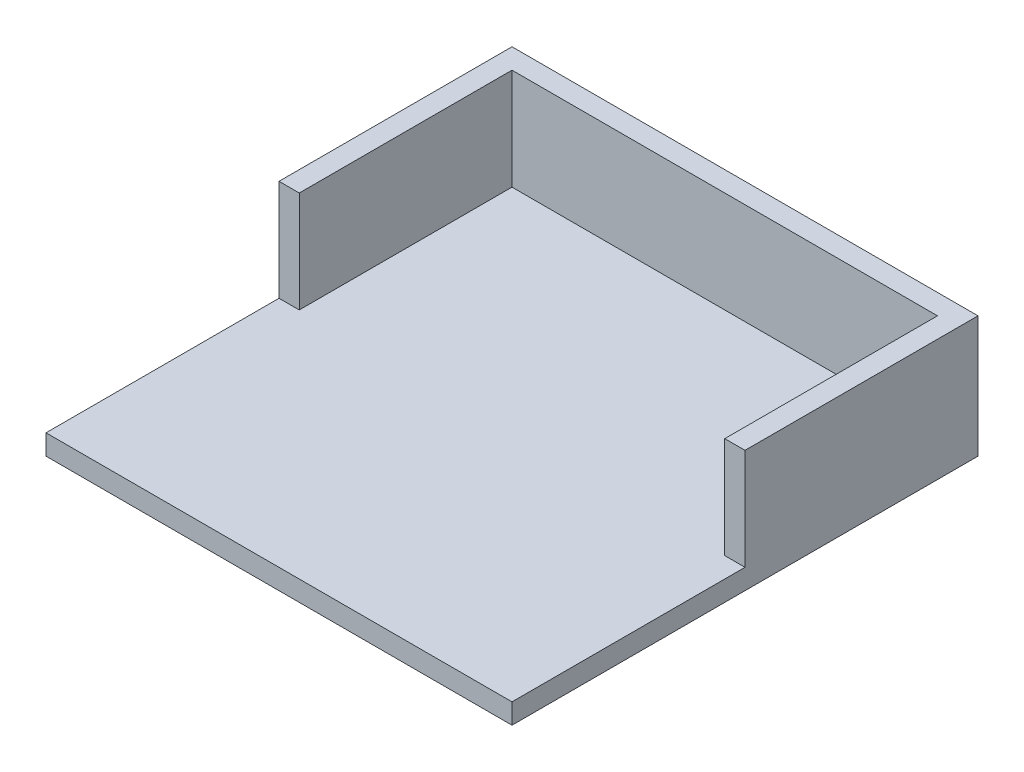
ISO-10303-21;
HEADER;
FILE_DESCRIPTION(('STEP AP214'),'2;1');
FILE_NAME('part.step','',(''),(''),'','','');
FILE_SCHEMA(('AUTOMOTIVE_DESIGN { 1 0 10303 214 1 1 1 1 }'));
ENDSEC;
DATA;
#1=APPLICATION_CONTEXT('core data for automotive mechanical design processes');
#2=APPLICATION_PROTOCOL_DEFINITION('international standard','automotive_design',2000,#1);
#3=PRODUCT_CONTEXT('',#1,'mechanical');
#4=PRODUCT('Part','Part','',(#3));
#5=PRODUCT_RELATED_PRODUCT_CATEGORY('part','',(#4));
#6=PRODUCT_DEFINITION_FORMATION('','',#4);
#7=PRODUCT_DEFINITION_CONTEXT('part definition',#1,'design');
#8=PRODUCT_DEFINITION('design','',#6,#7);
#9=PRODUCT_DEFINITION_SHAPE('','',#8);
#10=(LENGTH_UNIT() NAMED_UNIT(*) SI_UNIT(.MILLI.,.METRE.));
#11=(NAMED_UNIT(*) PLANE_ANGLE_UNIT() SI_UNIT($,.RADIAN.));
#12=(NAMED_UNIT(*) SI_UNIT($,.STERADIAN.) SOLID_ANGLE_UNIT());
#13=UNCERTAINTY_MEASURE_WITH_UNIT(LENGTH_MEASURE(1.E-05),#10,'distance_accuracy_value','');
#14=(GEOMETRIC_REPRESENTATION_CONTEXT(3) GLOBAL_UNCERTAINTY_ASSIGNED_CONTEXT((#13)) GLOBAL_UNIT_ASSIGNED_CONTEXT((#10,
#11,#12)) REPRESENTATION_CONTEXT('',''));
#15=CARTESIAN_POINT('',(0.,0.,0.));
#16=DIRECTION('',(0.,0.,1.));
#17=DIRECTION('',(1.,0.,0.));
#18=AXIS2_PLACEMENT_3D('',#15,#16,#17);
#19=CARTESIAN_POINT('',(0.,2.,0.));
#20=DIRECTION('',(1.,0.,0.));
#21=DIRECTION('',(0.,0.,-1.));
#22=AXIS2_PLACEMENT_3D('',#19,#20,#21);
#23=PLANE('',#22);
#24=DIRECTION('',(0.,0.,1.));
#25=VECTOR('',#24,1.);
#26=CARTESIAN_POINT('',(0.,2.,0.));
#27=LINE('',#26,#25);
#28=CARTESIAN_POINT('',(0.,2.,-23.));
#29=VERTEX_POINT('',#28);
#30=CARTESIAN_POINT('',(0.,2.,0.));
#31=VERTEX_POINT('',#30);
#32=EDGE_CURVE('E106',#29,#31,#27,.T.);
#33=ORIENTED_EDGE('',*,*,#32,.F.);
#34=DIRECTION('',(0.,1.,0.));
#35=VECTOR('',#34,1.);
#36=CARTESIAN_POINT('',(0.,2.,-23.));
#37=LINE('',#36,#35);
#38=CARTESIAN_POINT('',(0.,12.,-23.));
#39=VERTEX_POINT('',#38);
#40=EDGE_CURVE('E188',#29,#39,#37,.T.);
#41=ORIENTED_EDGE('',*,*,#40,.T.);
#42=DIRECTION('',(0.,0.,1.));
#43=VECTOR('',#42,1.);
#44=CARTESIAN_POINT('',(0.,12.,-46.));
#45=LINE('',#44,#43);
#46=CARTESIAN_POINT('',(0.,12.,-46.));
#47=VERTEX_POINT('',#46);
#48=EDGE_CURVE('E163',#47,#39,#45,.T.);
#49=ORIENTED_EDGE('',*,*,#48,.F.);
#50=DIRECTION('',(0.,-1.,0.));
#51=VECTOR('',#50,1.);
#52=CARTESIAN_POINT('',(0.,2.,-46.));
#53=LINE('',#52,#51);
#54=CARTESIAN_POINT('',(0.,0.,-46.));
#55=VERTEX_POINT('',#54);
#56=EDGE_CURVE('E131',#47,#55,#53,.T.);
#57=ORIENTED_EDGE('',*,*,#56,.T.);
#58=DIRECTION('',(0.,0.,1.));
#59=VECTOR('',#58,1.);
#60=CARTESIAN_POINT('',(0.,0.,0.));
#61=LINE('',#60,#59);
#62=CARTESIAN_POINT('',(0.,0.,0.));
#63=VERTEX_POINT('',#62);
#64=EDGE_CURVE('E129',#55,#63,#61,.T.);
#65=ORIENTED_EDGE('',*,*,#64,.T.);
#66=DIRECTION('',(0.,-1.,0.));
#67=VECTOR('',#66,1.);
#68=CARTESIAN_POINT('',(0.,2.,0.));
#69=LINE('',#68,#67);
#70=EDGE_CURVE('E11',#31,#63,#69,.T.);
#71=ORIENTED_EDGE('',*,*,#70,.F.);
#72=EDGE_LOOP('',(#33,#41,#49,#57,#65,#71));
#73=FACE_BOUND('',#72,.T.);
#74=ADVANCED_FACE('F33',(#73),#23,.F.);
#75=CARTESIAN_POINT('',(0.,2.,0.));
#76=DIRECTION('',(0.,0.,-1.));
#77=DIRECTION('',(-1.,0.,0.));
#78=AXIS2_PLACEMENT_3D('',#75,#76,#77);
#79=PLANE('',#78);
#80=DIRECTION('',(0.,-1.,0.));
#81=VECTOR('',#80,1.);
#82=CARTESIAN_POINT('',(46.,2.,0.));
#83=LINE('',#82,#81);
#84=CARTESIAN_POINT('',(46.,2.,0.));
#85=VERTEX_POINT('',#84);
#86=CARTESIAN_POINT('',(46.,0.,0.));
#87=VERTEX_POINT('',#86);
#88=EDGE_CURVE('E40',#85,#87,#83,.T.);
#89=ORIENTED_EDGE('',*,*,#88,.F.);
#90=DIRECTION('',(1.,0.,0.));
#91=VECTOR('',#90,1.);
#92=CARTESIAN_POINT('',(0.,2.,0.));
#93=LINE('',#92,#91);
#94=EDGE_CURVE('E110',#31,#85,#93,.T.);
#95=ORIENTED_EDGE('',*,*,#94,.F.);
#96=ORIENTED_EDGE('',*,*,#70,.T.);
#97=DIRECTION('',(1.,0.,0.));
#98=VECTOR('',#97,1.);
#99=CARTESIAN_POINT('',(0.,0.,0.));
#100=LINE('',#99,#98);
#101=EDGE_CURVE('E134',#63,#87,#100,.T.);
#102=ORIENTED_EDGE('',*,*,#101,.T.);
#103=EDGE_LOOP('',(#89,#95,#96,#102));
#104=FACE_BOUND('',#103,.T.);
#105=ADVANCED_FACE('F121',(#104),#79,.F.);
#106=CARTESIAN_POINT('',(46.,2.,0.));
#107=DIRECTION('',(-1.,0.,0.));
#108=DIRECTION('',(0.,0.,1.));
#109=AXIS2_PLACEMENT_3D('',#106,#107,#108);
#110=PLANE('',#109);
#111=DIRECTION('',(0.,0.,-1.));
#112=VECTOR('',#111,1.);
#113=CARTESIAN_POINT('',(46.,12.,-46.));
#114=LINE('',#113,#112);
#115=CARTESIAN_POINT('',(46.,12.,-23.));
#116=VERTEX_POINT('',#115);
#117=CARTESIAN_POINT('',(46.,12.,-46.));
#118=VERTEX_POINT('',#117);
#119=EDGE_CURVE('E140',#116,#118,#114,.T.);
#120=ORIENTED_EDGE('',*,*,#119,.F.);
#121=DIRECTION('',(0.,1.,0.));
#122=VECTOR('',#121,1.);
#123=CARTESIAN_POINT('',(46.,2.,-23.));
#124=LINE('',#123,#122);
#125=CARTESIAN_POINT('',(46.,2.,-23.));
#126=VERTEX_POINT('',#125);
#127=EDGE_CURVE('E160',#126,#116,#124,.T.);
#128=ORIENTED_EDGE('',*,*,#127,.F.);
#129=DIRECTION('',(0.,0.,-1.));
#130=VECTOR('',#129,1.);
#131=CARTESIAN_POINT('',(46.,2.,0.));
#132=LINE('',#131,#130);
#133=EDGE_CURVE('E124',#85,#126,#132,.T.);
#134=ORIENTED_EDGE('',*,*,#133,.F.);
#135=ORIENTED_EDGE('',*,*,#88,.T.);
#136=DIRECTION('',(0.,0.,-1.));
#137=VECTOR('',#136,1.);
#138=CARTESIAN_POINT('',(46.,0.,0.));
#139=LINE('',#138,#137);
#140=CARTESIAN_POINT('',(46.,0.,-46.));
#141=VERTEX_POINT('',#140);
#142=EDGE_CURVE('E137',#87,#141,#139,.T.);
#143=ORIENTED_EDGE('',*,*,#142,.T.);
#144=DIRECTION('',(0.,-1.,0.));
#145=VECTOR('',#144,1.);
#146=CARTESIAN_POINT('',(46.,2.,-46.));
#147=LINE('',#146,#145);
#148=EDGE_CURVE('E148',#118,#141,#147,.T.);
#149=ORIENTED_EDGE('',*,*,#148,.F.);
#150=EDGE_LOOP('',(#120,#128,#134,#135,#143,#149));
#151=FACE_BOUND('',#150,.T.);
#152=ADVANCED_FACE('F152',(#151),#110,.F.);
#153=CARTESIAN_POINT('',(0.,2.,-46.));
#154=DIRECTION('',(0.,0.,1.));
#155=DIRECTION('',(1.,0.,0.));
#156=AXIS2_PLACEMENT_3D('',#153,#154,#155);
#157=PLANE('',#156);
#158=DIRECTION('',(-1.,0.,0.));
#159=VECTOR('',#158,1.);
#160=CARTESIAN_POINT('',(0.,0.,-46.));
#161=LINE('',#160,#159);
#162=EDGE_CURVE('E145',#141,#55,#161,.T.);
#163=ORIENTED_EDGE('',*,*,#162,.T.);
#164=ORIENTED_EDGE('',*,*,#56,.F.);
#165=DIRECTION('',(-1.,0.,0.));
#166=VECTOR('',#165,1.);
#167=CARTESIAN_POINT('',(0.,12.,-46.));
#168=LINE('',#167,#166);
#169=EDGE_CURVE('E135',#118,#47,#168,.T.);
#170=ORIENTED_EDGE('',*,*,#169,.F.);
#171=ORIENTED_EDGE('',*,*,#148,.T.);
#172=EDGE_LOOP('',(#163,#164,#170,#171));
#173=FACE_BOUND('',#172,.T.);
#174=ADVANCED_FACE('F158',(#173),#157,.F.);
#175=CARTESIAN_POINT('',(0.,0.,0.));
#176=DIRECTION('',(0.,-1.,0.));
#177=DIRECTION('',(0.,0.,-1.));
#178=AXIS2_PLACEMENT_3D('',#175,#176,#177);
#179=PLANE('',#178);
#180=ORIENTED_EDGE('',*,*,#64,.F.);
#181=ORIENTED_EDGE('',*,*,#162,.F.);
#182=ORIENTED_EDGE('',*,*,#142,.F.);
#183=ORIENTED_EDGE('',*,*,#101,.F.);
#184=EDGE_LOOP('',(#180,#181,#182,#183));
#185=FACE_BOUND('',#184,.T.);
#186=ADVANCED_FACE('F156',(#185),#179,.T.);
#187=CARTESIAN_POINT('',(0.,12.,0.));
#188=DIRECTION('',(0.,1.,0.));
#189=DIRECTION('',(0.,0.,1.));
#190=AXIS2_PLACEMENT_3D('',#187,#188,#189);
#191=PLANE('',#190);
#192=DIRECTION('',(-1.,0.,0.));
#193=VECTOR('',#192,1.);
#194=CARTESIAN_POINT('',(0.,12.,-23.));
#195=LINE('',#194,#193);
#196=CARTESIAN_POINT('',(44.,12.,-23.));
#197=VERTEX_POINT('',#196);
#198=EDGE_CURVE('E117',#116,#197,#195,.T.);
#199=ORIENTED_EDGE('',*,*,#198,.F.);
#200=ORIENTED_EDGE('',*,*,#119,.T.);
#201=ORIENTED_EDGE('',*,*,#169,.T.);
#202=ORIENTED_EDGE('',*,*,#48,.T.);
#203=CARTESIAN_POINT('',(2.,12.,-23.));
#204=VERTEX_POINT('',#203);
#205=EDGE_CURVE('E192',#204,#39,#195,.T.);
#206=ORIENTED_EDGE('',*,*,#205,.F.);
#207=DIRECTION('',(0.,0.,1.));
#208=VECTOR('',#207,1.);
#209=CARTESIAN_POINT('',(2.,12.,-44.));
#210=LINE('',#209,#208);
#211=CARTESIAN_POINT('',(2.,12.,-44.));
#212=VERTEX_POINT('',#211);
#213=EDGE_CURVE('E181',#212,#204,#210,.T.);
#214=ORIENTED_EDGE('',*,*,#213,.F.);
#215=DIRECTION('',(-1.,0.,0.));
#216=VECTOR('',#215,1.);
#217=CARTESIAN_POINT('',(44.,12.,-44.));
#218=LINE('',#217,#216);
#219=CARTESIAN_POINT('',(44.,12.,-44.));
#220=VERTEX_POINT('',#219);
#221=EDGE_CURVE('E174',#220,#212,#218,.T.);
#222=ORIENTED_EDGE('',*,*,#221,.F.);
#223=DIRECTION('',(0.,0.,-1.));
#224=VECTOR('',#223,1.);
#225=CARTESIAN_POINT('',(44.,12.,-2.));
#226=LINE('',#225,#224);
#227=EDGE_CURVE('E172',#197,#220,#226,.T.);
#228=ORIENTED_EDGE('',*,*,#227,.F.);
#229=EDGE_LOOP('',(#199,#200,#201,#202,#206,#214,#222,#228));
#230=FACE_BOUND('',#229,.T.);
#231=ADVANCED_FACE('F213',(#230),#191,.T.);
#232=CARTESIAN_POINT('',(44.,12.,-44.));
#233=DIRECTION('',(0.,0.,1.));
#234=DIRECTION('',(1.,0.,0.));
#235=AXIS2_PLACEMENT_3D('',#232,#233,#234);
#236=PLANE('',#235);
#237=DIRECTION('',(-1.,0.,0.));
#238=VECTOR('',#237,1.);
#239=CARTESIAN_POINT('',(44.,2.,-44.));
#240=LINE('',#239,#238);
#241=CARTESIAN_POINT('',(44.,2.,-44.));
#242=VERTEX_POINT('',#241);
#243=CARTESIAN_POINT('',(2.,2.,-44.));
#244=VERTEX_POINT('',#243);
#245=EDGE_CURVE('E177',#242,#244,#240,.T.);
#246=ORIENTED_EDGE('',*,*,#245,.F.);
#247=DIRECTION('',(0.,-1.,0.));
#248=VECTOR('',#247,1.);
#249=CARTESIAN_POINT('',(44.,12.,-44.));
#250=LINE('',#249,#248);
#251=EDGE_CURVE('E170',#220,#242,#250,.T.);
#252=ORIENTED_EDGE('',*,*,#251,.F.);
#253=ORIENTED_EDGE('',*,*,#221,.T.);
#254=DIRECTION('',(0.,-1.,0.));
#255=VECTOR('',#254,1.);
#256=CARTESIAN_POINT('',(2.,12.,-44.));
#257=LINE('',#256,#255);
#258=EDGE_CURVE('E165',#212,#244,#257,.T.);
#259=ORIENTED_EDGE('',*,*,#258,.T.);
#260=EDGE_LOOP('',(#246,#252,#253,#259));
#261=FACE_BOUND('',#260,.T.);
#262=ADVANCED_FACE('F204',(#261),#236,.T.);
#263=CARTESIAN_POINT('',(2.,12.,-44.));
#264=DIRECTION('',(1.,0.,0.));
#265=DIRECTION('',(0.,0.,-1.));
#266=AXIS2_PLACEMENT_3D('',#263,#264,#265);
#267=PLANE('',#266);
#268=DIRECTION('',(0.,1.,0.));
#269=VECTOR('',#268,1.);
#270=CARTESIAN_POINT('',(2.,12.,-23.));
#271=LINE('',#270,#269);
#272=CARTESIAN_POINT('',(2.,2.,-23.));
#273=VERTEX_POINT('',#272);
#274=EDGE_CURVE('E179',#273,#204,#271,.T.);
#275=ORIENTED_EDGE('',*,*,#274,.F.);
#276=DIRECTION('',(0.,0.,1.));
#277=VECTOR('',#276,1.);
#278=CARTESIAN_POINT('',(2.,2.,-44.));
#279=LINE('',#278,#277);
#280=EDGE_CURVE('E175',#244,#273,#279,.T.);
#281=ORIENTED_EDGE('',*,*,#280,.F.);
#282=ORIENTED_EDGE('',*,*,#258,.F.);
#283=ORIENTED_EDGE('',*,*,#213,.T.);
#284=EDGE_LOOP('',(#275,#281,#282,#283));
#285=FACE_BOUND('',#284,.T.);
#286=ADVANCED_FACE('F208',(#285),#267,.T.);
#287=CARTESIAN_POINT('',(44.,12.,-2.));
#288=DIRECTION('',(-1.,0.,0.));
#289=DIRECTION('',(0.,0.,1.));
#290=AXIS2_PLACEMENT_3D('',#287,#288,#289);
#291=PLANE('',#290);
#292=DIRECTION('',(0.,-1.,0.));
#293=VECTOR('',#292,1.);
#294=CARTESIAN_POINT('',(44.,12.,-23.));
#295=LINE('',#294,#293);
#296=CARTESIAN_POINT('',(44.,2.,-23.));
#297=VERTEX_POINT('',#296);
#298=EDGE_CURVE('E186',#197,#297,#295,.T.);
#299=ORIENTED_EDGE('',*,*,#298,.F.);
#300=ORIENTED_EDGE('',*,*,#227,.T.);
#301=ORIENTED_EDGE('',*,*,#251,.T.);
#302=DIRECTION('',(0.,0.,-1.));
#303=VECTOR('',#302,1.);
#304=CARTESIAN_POINT('',(44.,2.,-2.));
#305=LINE('',#304,#303);
#306=EDGE_CURVE('E52',#297,#242,#305,.T.);
#307=ORIENTED_EDGE('',*,*,#306,.F.);
#308=EDGE_LOOP('',(#299,#300,#301,#307));
#309=FACE_BOUND('',#308,.T.);
#310=ADVANCED_FACE('F199',(#309),#291,.T.);
#311=CARTESIAN_POINT('',(0.,2.,0.));
#312=DIRECTION('',(0.,-1.,0.));
#313=DIRECTION('',(0.,0.,-1.));
#314=AXIS2_PLACEMENT_3D('',#311,#312,#313);
#315=PLANE('',#314);
#316=ORIENTED_EDGE('',*,*,#280,.T.);
#317=DIRECTION('',(-1.,0.,0.));
#318=VECTOR('',#317,1.);
#319=CARTESIAN_POINT('',(0.,2.,-23.));
#320=LINE('',#319,#318);
#321=EDGE_CURVE('E112',#273,#29,#320,.T.);
#322=ORIENTED_EDGE('',*,*,#321,.T.);
#323=ORIENTED_EDGE('',*,*,#32,.T.);
#324=ORIENTED_EDGE('',*,*,#94,.T.);
#325=ORIENTED_EDGE('',*,*,#133,.T.);
#326=EDGE_CURVE('E47',#126,#297,#320,.T.);
#327=ORIENTED_EDGE('',*,*,#326,.T.);
#328=ORIENTED_EDGE('',*,*,#306,.T.);
#329=ORIENTED_EDGE('',*,*,#245,.T.);
#330=EDGE_LOOP('',(#316,#322,#323,#324,#325,#327,#328,#329));
#331=FACE_BOUND('',#330,.T.);
#332=ADVANCED_FACE('F109',(#331),#315,.F.);
#333=CARTESIAN_POINT('',(0.,2.,-23.));
#334=DIRECTION('',(0.,0.,-1.));
#335=DIRECTION('',(-1.,0.,0.));
#336=AXIS2_PLACEMENT_3D('',#333,#334,#335);
#337=PLANE('',#336);
#338=ORIENTED_EDGE('',*,*,#274,.T.);
#339=ORIENTED_EDGE('',*,*,#205,.T.);
#340=ORIENTED_EDGE('',*,*,#40,.F.);
#341=ORIENTED_EDGE('',*,*,#321,.F.);
#342=EDGE_LOOP('',(#338,#339,#340,#341));
#343=FACE_BOUND('',#342,.T.);
#344=ADVANCED_FACE('F212',(#343),#337,.F.);
#345=ORIENTED_EDGE('',*,*,#298,.T.);
#346=ORIENTED_EDGE('',*,*,#326,.F.);
#347=ORIENTED_EDGE('',*,*,#127,.T.);
#348=ORIENTED_EDGE('',*,*,#198,.T.);
#349=EDGE_LOOP('',(#345,#346,#347,#348));
#350=FACE_BOUND('',#349,.T.);
#351=ADVANCED_FACE('F195',(#350),#337,.F.);
#352=CLOSED_SHELL('',(#74,#105,#152,#174,#186,#231,#262,#286,#310,#332,#344,#351));
#353=MANIFOLD_SOLID_BREP('B2',#352);
#354=ADVANCED_BREP_SHAPE_REPRESENTATION('',(#18,#353),#14);
#355=SHAPE_DEFINITION_REPRESENTATION(#9,#354);
ENDSEC;
END-ISO-10303-21;
